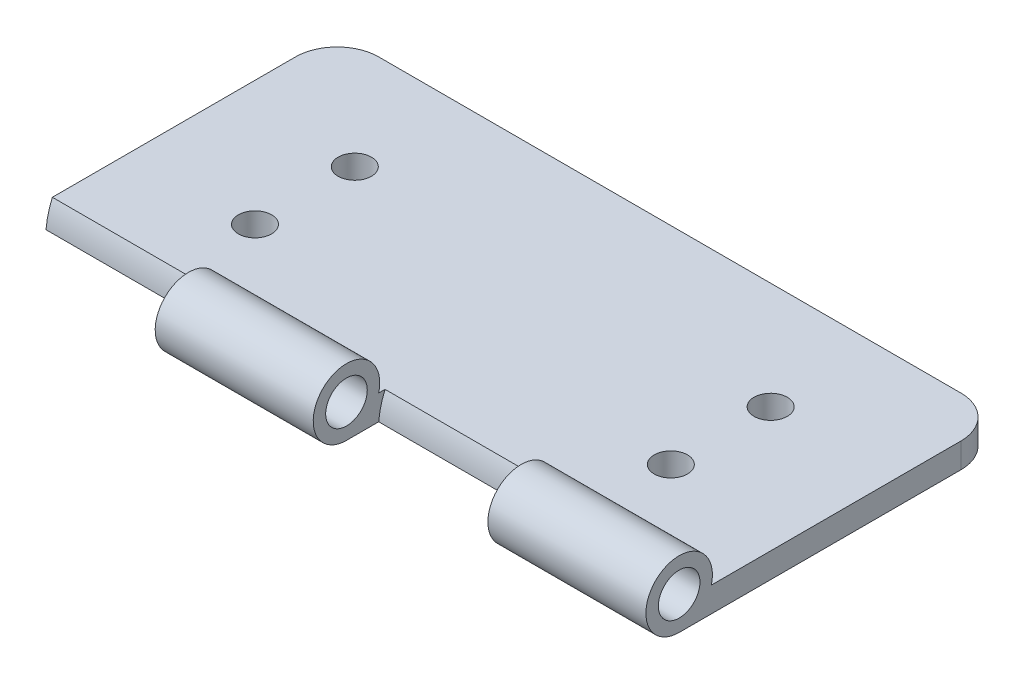
ISO-10303-21;
HEADER;
FILE_DESCRIPTION(('STEP AP214'),'2;1');
FILE_NAME('part.step','',(''),(''),'','','');
FILE_SCHEMA(('AUTOMOTIVE_DESIGN { 1 0 10303 214 1 1 1 1 }'));
ENDSEC;
DATA;
#1=APPLICATION_CONTEXT('core data for automotive mechanical design processes');
#2=APPLICATION_PROTOCOL_DEFINITION('international standard','automotive_design',2000,#1);
#3=PRODUCT_CONTEXT('',#1,'mechanical');
#4=PRODUCT('Part','Part','',(#3));
#5=PRODUCT_RELATED_PRODUCT_CATEGORY('part','',(#4));
#6=PRODUCT_DEFINITION_FORMATION('','',#4);
#7=PRODUCT_DEFINITION_CONTEXT('part definition',#1,'design');
#8=PRODUCT_DEFINITION('design','',#6,#7);
#9=PRODUCT_DEFINITION_SHAPE('','',#8);
#10=(LENGTH_UNIT() NAMED_UNIT(*) SI_UNIT(.MILLI.,.METRE.));
#11=(NAMED_UNIT(*) PLANE_ANGLE_UNIT() SI_UNIT($,.RADIAN.));
#12=(NAMED_UNIT(*) SI_UNIT($,.STERADIAN.) SOLID_ANGLE_UNIT());
#13=UNCERTAINTY_MEASURE_WITH_UNIT(LENGTH_MEASURE(1.E-05),#10,'distance_accuracy_value','');
#14=(GEOMETRIC_REPRESENTATION_CONTEXT(3) GLOBAL_UNCERTAINTY_ASSIGNED_CONTEXT((#13)) GLOBAL_UNIT_ASSIGNED_CONTEXT((#10,
#11,#12)) REPRESENTATION_CONTEXT('',''));
#15=CARTESIAN_POINT('',(0.,0.,0.));
#16=DIRECTION('',(0.,0.,1.));
#17=DIRECTION('',(1.,0.,0.));
#18=AXIS2_PLACEMENT_3D('',#15,#16,#17);
#19=CARTESIAN_POINT('',(40.,3.,-12.5));
#20=DIRECTION('',(-1.,0.,0.));
#21=DIRECTION('',(0.,0.,1.));
#22=AXIS2_PLACEMENT_3D('',#19,#20,#21);
#23=PLANE('',#22);
#24=DIRECTION('',(0.,0.,-1.));
#25=VECTOR('',#24,1.);
#26=CARTESIAN_POINT('',(40.,0.,-12.5));
#27=LINE('',#26,#25);
#28=CARTESIAN_POINT('',(40.,0.,21.3729833462074));
#29=VERTEX_POINT('',#28);
#30=CARTESIAN_POINT('',(40.,0.,-12.5));
#31=VERTEX_POINT('',#30);
#32=EDGE_CURVE('E181',#29,#31,#27,.T.);
#33=ORIENTED_EDGE('',*,*,#32,.T.);
#34=DIRECTION('',(0.,-1.,0.));
#35=VECTOR('',#34,1.);
#36=CARTESIAN_POINT('',(40.,3.,-12.5));
#37=LINE('',#36,#35);
#38=CARTESIAN_POINT('',(40.,3.,-12.5));
#39=VERTEX_POINT('',#38);
#40=EDGE_CURVE('E218',#39,#31,#37,.T.);
#41=ORIENTED_EDGE('',*,*,#40,.F.);
#42=DIRECTION('',(0.,0.,-1.));
#43=VECTOR('',#42,1.);
#44=CARTESIAN_POINT('',(40.,3.,-12.5));
#45=LINE('',#44,#43);
#46=CARTESIAN_POINT('',(40.,3.,17.5));
#47=VERTEX_POINT('',#46);
#48=EDGE_CURVE('E183',#47,#39,#45,.T.);
#49=ORIENTED_EDGE('',*,*,#48,.F.);
#50=CARTESIAN_POINT('',(40.,4.,21.3729833462074));
#51=DIRECTION('',(1.,0.,0.));
#52=DIRECTION('',(0.,0.,-1.));
#53=AXIS2_PLACEMENT_3D('',#50,#51,#52);
#54=CIRCLE('',#53,4.);
#55=EDGE_CURVE('E168',#47,#29,#54,.T.);
#56=ORIENTED_EDGE('',*,*,#55,.T.);
#57=EDGE_LOOP('',(#33,#41,#49,#56));
#58=FACE_BOUND('',#57,.T.);
#59=CARTESIAN_POINT('',(40.,4.,21.3729833462074));
#60=DIRECTION('',(1.,0.,0.));
#61=DIRECTION('',(0.,0.,-1.));
#62=AXIS2_PLACEMENT_3D('',#59,#60,#61);
#63=CIRCLE('',#62,2.5);
#64=CARTESIAN_POINT('',(40.,4.,18.8729833462074));
#65=VERTEX_POINT('',#64);
#66=EDGE_CURVE('E146',#65,#65,#63,.T.);
#67=ORIENTED_EDGE('',*,*,#66,.F.);
#68=EDGE_LOOP('',(#67));
#69=FACE_BOUND('',#68,.T.);
#70=ADVANCED_FACE('F38',(#58,#69),#23,.F.);
#71=CARTESIAN_POINT('',(35.,3.,-12.5));
#72=DIRECTION('',(0.,-1.,0.));
#73=DIRECTION('',(0.,0.,-1.));
#74=AXIS2_PLACEMENT_3D('',#71,#72,#73);
#75=CYLINDRICAL_SURFACE('',#74,5.);
#76=CARTESIAN_POINT('',(35.,0.,-12.5));
#77=DIRECTION('',(0.,1.,0.));
#78=DIRECTION('',(0.,0.,1.));
#79=AXIS2_PLACEMENT_3D('',#76,#77,#78);
#80=CIRCLE('',#79,5.);
#81=CARTESIAN_POINT('',(35.,0.,-17.5));
#82=VERTEX_POINT('',#81);
#83=EDGE_CURVE('E199',#31,#82,#80,.T.);
#84=ORIENTED_EDGE('',*,*,#83,.T.);
#85=DIRECTION('',(0.,-1.,0.));
#86=VECTOR('',#85,1.);
#87=CARTESIAN_POINT('',(35.,3.,-17.5));
#88=LINE('',#87,#86);
#89=CARTESIAN_POINT('',(35.,3.,-17.5));
#90=VERTEX_POINT('',#89);
#91=EDGE_CURVE('E215',#90,#82,#88,.T.);
#92=ORIENTED_EDGE('',*,*,#91,.F.);
#93=CARTESIAN_POINT('',(35.,3.,-12.5));
#94=DIRECTION('',(0.,1.,0.));
#95=DIRECTION('',(0.,0.,1.));
#96=AXIS2_PLACEMENT_3D('',#93,#94,#95);
#97=CIRCLE('',#96,5.);
#98=EDGE_CURVE('E186',#39,#90,#97,.T.);
#99=ORIENTED_EDGE('',*,*,#98,.F.);
#100=ORIENTED_EDGE('',*,*,#40,.T.);
#101=EDGE_LOOP('',(#84,#92,#99,#100));
#102=FACE_BOUND('',#101,.T.);
#103=ADVANCED_FACE('F263',(#102),#75,.T.);
#104=CARTESIAN_POINT('',(-35.,3.,-17.5));
#105=DIRECTION('',(0.,0.,1.));
#106=DIRECTION('',(1.,0.,0.));
#107=AXIS2_PLACEMENT_3D('',#104,#105,#106);
#108=PLANE('',#107);
#109=DIRECTION('',(-1.,0.,0.));
#110=VECTOR('',#109,1.);
#111=CARTESIAN_POINT('',(-35.,0.,-17.5));
#112=LINE('',#111,#110);
#113=CARTESIAN_POINT('',(-35.,0.,-17.5));
#114=VERTEX_POINT('',#113);
#115=EDGE_CURVE('E201',#82,#114,#112,.T.);
#116=ORIENTED_EDGE('',*,*,#115,.T.);
#117=DIRECTION('',(0.,-1.,0.));
#118=VECTOR('',#117,1.);
#119=CARTESIAN_POINT('',(-35.,3.,-17.5));
#120=LINE('',#119,#118);
#121=CARTESIAN_POINT('',(-35.,3.,-17.5));
#122=VERTEX_POINT('',#121);
#123=EDGE_CURVE('E212',#122,#114,#120,.T.);
#124=ORIENTED_EDGE('',*,*,#123,.F.);
#125=DIRECTION('',(-1.,0.,0.));
#126=VECTOR('',#125,1.);
#127=CARTESIAN_POINT('',(-35.,3.,-17.5));
#128=LINE('',#127,#126);
#129=EDGE_CURVE('E189',#90,#122,#128,.T.);
#130=ORIENTED_EDGE('',*,*,#129,.F.);
#131=ORIENTED_EDGE('',*,*,#91,.T.);
#132=EDGE_LOOP('',(#116,#124,#130,#131));
#133=FACE_BOUND('',#132,.T.);
#134=ADVANCED_FACE('F259',(#133),#108,.F.);
#135=CARTESIAN_POINT('',(-35.,3.,-12.5));
#136=DIRECTION('',(0.,-1.,0.));
#137=DIRECTION('',(0.,0.,-1.));
#138=AXIS2_PLACEMENT_3D('',#135,#136,#137);
#139=CYLINDRICAL_SURFACE('',#138,5.);
#140=CARTESIAN_POINT('',(-35.,0.,-12.5));
#141=DIRECTION('',(0.,1.,0.));
#142=DIRECTION('',(0.,0.,-1.));
#143=AXIS2_PLACEMENT_3D('',#140,#141,#142);
#144=CIRCLE('',#143,5.);
#145=CARTESIAN_POINT('',(-40.,0.,-12.5));
#146=VERTEX_POINT('',#145);
#147=EDGE_CURVE('E203',#114,#146,#144,.T.);
#148=ORIENTED_EDGE('',*,*,#147,.T.);
#149=DIRECTION('',(0.,-1.,0.));
#150=VECTOR('',#149,1.);
#151=CARTESIAN_POINT('',(-40.,3.,-12.5));
#152=LINE('',#151,#150);
#153=CARTESIAN_POINT('',(-40.,3.,-12.5));
#154=VERTEX_POINT('',#153);
#155=EDGE_CURVE('E196',#154,#146,#152,.T.);
#156=ORIENTED_EDGE('',*,*,#155,.F.);
#157=CARTESIAN_POINT('',(-35.,3.,-12.5));
#158=DIRECTION('',(0.,1.,0.));
#159=DIRECTION('',(0.,0.,-1.));
#160=AXIS2_PLACEMENT_3D('',#157,#158,#159);
#161=CIRCLE('',#160,5.);
#162=EDGE_CURVE('E191',#122,#154,#161,.T.);
#163=ORIENTED_EDGE('',*,*,#162,.F.);
#164=ORIENTED_EDGE('',*,*,#123,.T.);
#165=EDGE_LOOP('',(#148,#156,#163,#164));
#166=FACE_BOUND('',#165,.T.);
#167=ADVANCED_FACE('F255',(#166),#139,.T.);
#168=CARTESIAN_POINT('',(-40.,3.,-12.5));
#169=DIRECTION('',(1.,0.,0.));
#170=DIRECTION('',(0.,0.,-1.));
#171=AXIS2_PLACEMENT_3D('',#168,#169,#170);
#172=PLANE('',#171);
#173=DIRECTION('',(0.,0.,1.));
#174=VECTOR('',#173,1.);
#175=CARTESIAN_POINT('',(-40.,0.,-12.5));
#176=LINE('',#175,#174);
#177=CARTESIAN_POINT('',(-40.,0.,17.5));
#178=VERTEX_POINT('',#177);
#179=EDGE_CURVE('E205',#146,#178,#176,.T.);
#180=ORIENTED_EDGE('',*,*,#179,.T.);
#181=CARTESIAN_POINT('',(-40.,-0.938013702814571,7.54409068475752));
#182=DIRECTION('',(1.,0.,0.));
#183=DIRECTION('',(0.,0.,-1.));
#184=AXIS2_PLACEMENT_3D('',#181,#182,#183);
#185=CIRCLE('',#184,10.);
#186=CARTESIAN_POINT('',(-40.,3.,16.7360463023856));
#187=VERTEX_POINT('',#186);
#188=EDGE_CURVE('E230',#178,#187,#185,.F.);
#189=ORIENTED_EDGE('',*,*,#188,.T.);
#190=DIRECTION('',(0.,0.,1.));
#191=VECTOR('',#190,1.);
#192=CARTESIAN_POINT('',(-40.,3.,-12.5));
#193=LINE('',#192,#191);
#194=EDGE_CURVE('E193',#154,#187,#193,.T.);
#195=ORIENTED_EDGE('',*,*,#194,.F.);
#196=ORIENTED_EDGE('',*,*,#155,.T.);
#197=EDGE_LOOP('',(#180,#189,#195,#196));
#198=FACE_BOUND('',#197,.T.);
#199=ADVANCED_FACE('F251',(#198),#172,.F.);
#200=CARTESIAN_POINT('',(-35.,3.,-12.5));
#201=DIRECTION('',(0.,-1.,0.));
#202=DIRECTION('',(0.,0.,-1.));
#203=AXIS2_PLACEMENT_3D('',#200,#201,#202);
#204=PLANE('',#203);
#205=CARTESIAN_POINT('',(-25.,3.,-4.62701665379257));
#206=DIRECTION('',(0.,-1.,0.));
#207=DIRECTION('',(0.,0.,-1.));
#208=AXIS2_PLACEMENT_3D('',#205,#206,#207);
#209=CIRCLE('',#208,2.);
#210=CARTESIAN_POINT('',(-25.,3.,-6.62701665379257));
#211=VERTEX_POINT('',#210);
#212=EDGE_CURVE('E160',#211,#211,#209,.T.);
#213=ORIENTED_EDGE('',*,*,#212,.T.);
#214=EDGE_LOOP('',(#213));
#215=FACE_BOUND('',#214,.T.);
#216=CARTESIAN_POINT('',(25.,3.,7.37298334620743));
#217=DIRECTION('',(0.,-1.,0.));
#218=DIRECTION('',(0.,0.,-1.));
#219=AXIS2_PLACEMENT_3D('',#216,#217,#218);
#220=CIRCLE('',#219,2.);
#221=CARTESIAN_POINT('',(25.,3.,5.37298334620743));
#222=VERTEX_POINT('',#221);
#223=EDGE_CURVE('E404',#222,#222,#220,.T.);
#224=ORIENTED_EDGE('',*,*,#223,.T.);
#225=EDGE_LOOP('',(#224));
#226=FACE_BOUND('',#225,.T.);
#227=CARTESIAN_POINT('',(25.,3.,-4.62701665379257));
#228=DIRECTION('',(0.,-1.,0.));
#229=DIRECTION('',(0.,0.,-1.));
#230=AXIS2_PLACEMENT_3D('',#227,#228,#229);
#231=CIRCLE('',#230,2.);
#232=CARTESIAN_POINT('',(25.,3.,-6.62701665379257));
#233=VERTEX_POINT('',#232);
#234=EDGE_CURVE('E406',#233,#233,#231,.T.);
#235=ORIENTED_EDGE('',*,*,#234,.T.);
#236=EDGE_LOOP('',(#235));
#237=FACE_BOUND('',#236,.T.);
#238=CARTESIAN_POINT('',(-25.,3.,7.37298334620743));
#239=DIRECTION('',(0.,-1.,0.));
#240=DIRECTION('',(0.,0.,-1.));
#241=AXIS2_PLACEMENT_3D('',#238,#239,#240);
#242=CIRCLE('',#241,2.);
#243=CARTESIAN_POINT('',(-25.,3.,5.37298334620743));
#244=VERTEX_POINT('',#243);
#245=EDGE_CURVE('E411',#244,#244,#242,.T.);
#246=ORIENTED_EDGE('',*,*,#245,.T.);
#247=EDGE_LOOP('',(#246));
#248=FACE_BOUND('',#247,.T.);
#249=DIRECTION('',(0.,0.,-1.));
#250=VECTOR('',#249,1.);
#251=CARTESIAN_POINT('',(0.,3.,0.));
#252=LINE('',#251,#250);
#253=CARTESIAN_POINT('',(0.,3.,17.5));
#254=VERTEX_POINT('',#253);
#255=CARTESIAN_POINT('',(0.,3.,16.7360463023856));
#256=VERTEX_POINT('',#255);
#257=EDGE_CURVE('E60',#254,#256,#252,.T.);
#258=ORIENTED_EDGE('',*,*,#257,.T.);
#259=DIRECTION('',(-1.,0.,0.));
#260=VECTOR('',#259,1.);
#261=CARTESIAN_POINT('',(10.5,3.,16.7360463023856));
#262=LINE('',#261,#260);
#263=CARTESIAN_POINT('',(21.,3.,16.7360463023856));
#264=VERTEX_POINT('',#263);
#265=EDGE_CURVE('E228',#256,#264,#262,.F.);
#266=ORIENTED_EDGE('',*,*,#265,.T.);
#267=DIRECTION('',(0.,0.,1.));
#268=VECTOR('',#267,1.);
#269=CARTESIAN_POINT('',(21.,3.,-12.5));
#270=LINE('',#269,#268);
#271=CARTESIAN_POINT('',(21.,3.,17.5));
#272=VERTEX_POINT('',#271);
#273=EDGE_CURVE('E53',#264,#272,#270,.T.);
#274=ORIENTED_EDGE('',*,*,#273,.T.);
#275=DIRECTION('',(1.,0.,0.));
#276=VECTOR('',#275,1.);
#277=CARTESIAN_POINT('',(21.,3.,17.5));
#278=LINE('',#277,#276);
#279=EDGE_CURVE('E173',#272,#47,#278,.T.);
#280=ORIENTED_EDGE('',*,*,#279,.T.);
#281=ORIENTED_EDGE('',*,*,#48,.T.);
#282=ORIENTED_EDGE('',*,*,#98,.T.);
#283=ORIENTED_EDGE('',*,*,#129,.T.);
#284=ORIENTED_EDGE('',*,*,#162,.T.);
#285=ORIENTED_EDGE('',*,*,#194,.T.);
#286=DIRECTION('',(-1.,0.,0.));
#287=VECTOR('',#286,1.);
#288=CARTESIAN_POINT('',(-29.5,3.,16.7360463023856));
#289=LINE('',#288,#287);
#290=CARTESIAN_POINT('',(-19.,3.,16.7360463023856));
#291=VERTEX_POINT('',#290);
#292=EDGE_CURVE('E225',#187,#291,#289,.F.);
#293=ORIENTED_EDGE('',*,*,#292,.T.);
#294=DIRECTION('',(0.,0.,1.));
#295=VECTOR('',#294,1.);
#296=CARTESIAN_POINT('',(-19.,3.,-12.5));
#297=LINE('',#296,#295);
#298=CARTESIAN_POINT('',(-19.,3.,17.5));
#299=VERTEX_POINT('',#298);
#300=EDGE_CURVE('E221',#291,#299,#297,.T.);
#301=ORIENTED_EDGE('',*,*,#300,.T.);
#302=DIRECTION('',(1.,0.,0.));
#303=VECTOR('',#302,1.);
#304=CARTESIAN_POINT('',(-19.,3.,17.5));
#305=LINE('',#304,#303);
#306=EDGE_CURVE('E135',#299,#254,#305,.T.);
#307=ORIENTED_EDGE('',*,*,#306,.T.);
#308=EDGE_LOOP('',(#258,#266,#274,#280,#281,#282,#283,#284,#285,#293,#301,#307));
#309=FACE_BOUND('',#308,.T.);
#310=ADVANCED_FACE('F243',(#215,#226,#237,#248,#309),#204,.F.);
#311=CARTESIAN_POINT('',(-35.,0.,-12.5));
#312=DIRECTION('',(0.,-1.,0.));
#313=DIRECTION('',(0.,0.,-1.));
#314=AXIS2_PLACEMENT_3D('',#311,#312,#313);
#315=PLANE('',#314);
#316=CARTESIAN_POINT('',(-25.,0.,-4.62701665379257));
#317=DIRECTION('',(0.,-1.,0.));
#318=DIRECTION('',(0.,0.,-1.));
#319=AXIS2_PLACEMENT_3D('',#316,#317,#318);
#320=CIRCLE('',#319,2.);
#321=CARTESIAN_POINT('',(-25.,0.,-6.62701665379257));
#322=VERTEX_POINT('',#321);
#323=EDGE_CURVE('E401',#322,#322,#320,.T.);
#324=ORIENTED_EDGE('',*,*,#323,.F.);
#325=EDGE_LOOP('',(#324));
#326=FACE_BOUND('',#325,.T.);
#327=CARTESIAN_POINT('',(25.,0.,7.37298334620743));
#328=DIRECTION('',(0.,-1.,0.));
#329=DIRECTION('',(0.,0.,-1.));
#330=AXIS2_PLACEMENT_3D('',#327,#328,#329);
#331=CIRCLE('',#330,2.);
#332=CARTESIAN_POINT('',(25.,0.,5.37298334620743));
#333=VERTEX_POINT('',#332);
#334=EDGE_CURVE('E417',#333,#333,#331,.T.);
#335=ORIENTED_EDGE('',*,*,#334,.F.);
#336=EDGE_LOOP('',(#335));
#337=FACE_BOUND('',#336,.T.);
#338=CARTESIAN_POINT('',(25.,0.,-4.62701665379257));
#339=DIRECTION('',(0.,-1.,0.));
#340=DIRECTION('',(0.,0.,-1.));
#341=AXIS2_PLACEMENT_3D('',#338,#339,#340);
#342=CIRCLE('',#341,2.);
#343=CARTESIAN_POINT('',(25.,0.,-6.62701665379257));
#344=VERTEX_POINT('',#343);
#345=EDGE_CURVE('E420',#344,#344,#342,.T.);
#346=ORIENTED_EDGE('',*,*,#345,.F.);
#347=EDGE_LOOP('',(#346));
#348=FACE_BOUND('',#347,.T.);
#349=CARTESIAN_POINT('',(-25.,0.,7.37298334620743));
#350=DIRECTION('',(0.,-1.,0.));
#351=DIRECTION('',(0.,0.,-1.));
#352=AXIS2_PLACEMENT_3D('',#349,#350,#351);
#353=CIRCLE('',#352,2.);
#354=CARTESIAN_POINT('',(-25.,0.,5.37298334620743));
#355=VERTEX_POINT('',#354);
#356=EDGE_CURVE('E414',#355,#355,#353,.T.);
#357=ORIENTED_EDGE('',*,*,#356,.F.);
#358=EDGE_LOOP('',(#357));
#359=FACE_BOUND('',#358,.T.);
#360=ORIENTED_EDGE('',*,*,#32,.F.);
#361=DIRECTION('',(1.,0.,0.));
#362=VECTOR('',#361,1.);
#363=CARTESIAN_POINT('',(21.,0.,21.3729833462074));
#364=LINE('',#363,#362);
#365=CARTESIAN_POINT('',(21.,0.,21.3729833462074));
#366=VERTEX_POINT('',#365);
#367=EDGE_CURVE('E178',#366,#29,#364,.T.);
#368=ORIENTED_EDGE('',*,*,#367,.F.);
#369=DIRECTION('',(0.,0.,1.));
#370=VECTOR('',#369,1.);
#371=CARTESIAN_POINT('',(21.,0.,0.));
#372=LINE('',#371,#370);
#373=CARTESIAN_POINT('',(21.,0.,17.5));
#374=VERTEX_POINT('',#373);
#375=EDGE_CURVE('E171',#374,#366,#372,.T.);
#376=ORIENTED_EDGE('',*,*,#375,.F.);
#377=DIRECTION('',(1.,0.,0.));
#378=VECTOR('',#377,1.);
#379=CARTESIAN_POINT('',(-40.,0.,17.5));
#380=LINE('',#379,#378);
#381=CARTESIAN_POINT('',(0.,0.,17.5));
#382=VERTEX_POINT('',#381);
#383=EDGE_CURVE('E208',#382,#374,#380,.T.);
#384=ORIENTED_EDGE('',*,*,#383,.F.);
#385=DIRECTION('',(0.,0.,1.));
#386=VECTOR('',#385,1.);
#387=CARTESIAN_POINT('',(0.,0.,0.));
#388=LINE('',#387,#386);
#389=CARTESIAN_POINT('',(0.,0.,21.3729833462074));
#390=VERTEX_POINT('',#389);
#391=EDGE_CURVE('E142',#382,#390,#388,.T.);
#392=ORIENTED_EDGE('',*,*,#391,.T.);
#393=DIRECTION('',(1.,0.,0.));
#394=VECTOR('',#393,1.);
#395=CARTESIAN_POINT('',(-19.,0.,21.3729833462074));
#396=LINE('',#395,#394);
#397=CARTESIAN_POINT('',(-19.,0.,21.3729833462074));
#398=VERTEX_POINT('',#397);
#399=EDGE_CURVE('E138',#398,#390,#396,.T.);
#400=ORIENTED_EDGE('',*,*,#399,.F.);
#401=DIRECTION('',(0.,0.,1.));
#402=VECTOR('',#401,1.);
#403=CARTESIAN_POINT('',(-19.,0.,0.));
#404=LINE('',#403,#402);
#405=CARTESIAN_POINT('',(-19.,0.,17.5));
#406=VERTEX_POINT('',#405);
#407=EDGE_CURVE('E126',#406,#398,#404,.T.);
#408=ORIENTED_EDGE('',*,*,#407,.F.);
#409=EDGE_CURVE('E187',#178,#406,#380,.T.);
#410=ORIENTED_EDGE('',*,*,#409,.F.);
#411=ORIENTED_EDGE('',*,*,#179,.F.);
#412=ORIENTED_EDGE('',*,*,#147,.F.);
#413=ORIENTED_EDGE('',*,*,#115,.F.);
#414=ORIENTED_EDGE('',*,*,#83,.F.);
#415=EDGE_LOOP('',(#360,#368,#376,#384,#392,#400,#408,#410,#411,#412,#413,#414));
#416=FACE_BOUND('',#415,.T.);
#417=ADVANCED_FACE('F139',(#326,#337,#348,#359,#416),#315,.T.);
#418=CARTESIAN_POINT('',(21.,4.,21.3729833462074));
#419=DIRECTION('',(1.,0.,0.));
#420=DIRECTION('',(0.,0.,-1.));
#421=AXIS2_PLACEMENT_3D('',#418,#419,#420);
#422=CYLINDRICAL_SURFACE('',#421,2.5);
#423=CARTESIAN_POINT('',(21.,4.,21.3729833462074));
#424=DIRECTION('',(1.,0.,0.));
#425=DIRECTION('',(0.,0.,-1.));
#426=AXIS2_PLACEMENT_3D('',#423,#424,#425);
#427=CIRCLE('',#426,2.5);
#428=CARTESIAN_POINT('',(21.,4.,18.8729833462074));
#429=VERTEX_POINT('',#428);
#430=EDGE_CURVE('E164',#429,#429,#427,.T.);
#431=ORIENTED_EDGE('',*,*,#430,.F.);
#432=EDGE_LOOP('',(#431));
#433=FACE_BOUND('',#432,.T.);
#434=ORIENTED_EDGE('',*,*,#66,.T.);
#435=EDGE_LOOP('',(#434));
#436=FACE_BOUND('',#435,.T.);
#437=ADVANCED_FACE('F272',(#433,#436),#422,.F.);
#438=CARTESIAN_POINT('',(21.,4.,21.3729833462074));
#439=DIRECTION('',(1.,0.,0.));
#440=DIRECTION('',(0.,0.,-1.));
#441=AXIS2_PLACEMENT_3D('',#438,#439,#440);
#442=CYLINDRICAL_SURFACE('',#441,4.);
#443=ORIENTED_EDGE('',*,*,#55,.F.);
#444=ORIENTED_EDGE('',*,*,#279,.F.);
#445=CARTESIAN_POINT('',(21.,4.,21.3729833462074));
#446=DIRECTION('',(1.,0.,0.));
#447=DIRECTION('',(0.,0.,-1.));
#448=AXIS2_PLACEMENT_3D('',#445,#446,#447);
#449=CIRCLE('',#448,4.);
#450=EDGE_CURVE('E167',#272,#366,#449,.T.);
#451=ORIENTED_EDGE('',*,*,#450,.T.);
#452=ORIENTED_EDGE('',*,*,#367,.T.);
#453=EDGE_LOOP('',(#443,#444,#451,#452));
#454=FACE_BOUND('',#453,.T.);
#455=ADVANCED_FACE('F270',(#454),#442,.T.);
#456=CARTESIAN_POINT('',(21.,0.,0.));
#457=DIRECTION('',(1.,0.,0.));
#458=DIRECTION('',(0.,0.,-1.));
#459=AXIS2_PLACEMENT_3D('',#456,#457,#458);
#460=PLANE('',#459);
#461=ORIENTED_EDGE('',*,*,#430,.T.);
#462=EDGE_LOOP('',(#461));
#463=FACE_BOUND('',#462,.T.);
#464=ORIENTED_EDGE('',*,*,#450,.F.);
#465=ORIENTED_EDGE('',*,*,#273,.F.);
#466=CARTESIAN_POINT('',(21.,-0.938013702814571,7.54409068475752));
#467=DIRECTION('',(1.,0.,0.));
#468=DIRECTION('',(0.,0.,-1.));
#469=AXIS2_PLACEMENT_3D('',#466,#467,#468);
#470=CIRCLE('',#469,10.);
#471=EDGE_CURVE('E46',#264,#374,#470,.T.);
#472=ORIENTED_EDGE('',*,*,#471,.T.);
#473=ORIENTED_EDGE('',*,*,#375,.T.);
#474=EDGE_LOOP('',(#464,#465,#472,#473));
#475=FACE_BOUND('',#474,.T.);
#476=ADVANCED_FACE('F235',(#463,#475),#460,.F.);
#477=CARTESIAN_POINT('',(-19.,4.,21.3729833462074));
#478=DIRECTION('',(1.,0.,0.));
#479=DIRECTION('',(0.,0.,-1.));
#480=AXIS2_PLACEMENT_3D('',#477,#478,#479);
#481=CYLINDRICAL_SURFACE('',#480,2.5);
#482=CARTESIAN_POINT('',(-19.,4.,21.3729833462074));
#483=DIRECTION('',(1.,0.,0.));
#484=DIRECTION('',(0.,0.,-1.));
#485=AXIS2_PLACEMENT_3D('',#482,#483,#484);
#486=CIRCLE('',#485,2.5);
#487=CARTESIAN_POINT('',(-19.,4.,18.8729833462074));
#488=VERTEX_POINT('',#487);
#489=EDGE_CURVE('E150',#488,#488,#486,.T.);
#490=ORIENTED_EDGE('',*,*,#489,.F.);
#491=EDGE_LOOP('',(#490));
#492=FACE_BOUND('',#491,.T.);
#493=CARTESIAN_POINT('',(0.,4.,21.3729833462074));
#494=DIRECTION('',(1.,0.,0.));
#495=DIRECTION('',(0.,0.,-1.));
#496=AXIS2_PLACEMENT_3D('',#493,#494,#495);
#497=CIRCLE('',#496,2.5);
#498=CARTESIAN_POINT('',(0.,4.,18.8729833462074));
#499=VERTEX_POINT('',#498);
#500=EDGE_CURVE('E156',#499,#499,#497,.T.);
#501=ORIENTED_EDGE('',*,*,#500,.T.);
#502=EDGE_LOOP('',(#501));
#503=FACE_BOUND('',#502,.T.);
#504=ADVANCED_FACE('F278',(#492,#503),#481,.F.);
#505=CARTESIAN_POINT('',(-19.,4.,21.3729833462074));
#506=DIRECTION('',(1.,0.,0.));
#507=DIRECTION('',(0.,0.,-1.));
#508=AXIS2_PLACEMENT_3D('',#505,#506,#507);
#509=CYLINDRICAL_SURFACE('',#508,4.);
#510=CARTESIAN_POINT('',(0.,4.,21.3729833462074));
#511=DIRECTION('',(1.,0.,0.));
#512=DIRECTION('',(0.,0.,-1.));
#513=AXIS2_PLACEMENT_3D('',#510,#511,#512);
#514=CIRCLE('',#513,4.);
#515=EDGE_CURVE('E159',#254,#390,#514,.T.);
#516=ORIENTED_EDGE('',*,*,#515,.F.);
#517=ORIENTED_EDGE('',*,*,#306,.F.);
#518=CARTESIAN_POINT('',(-19.,4.,21.3729833462074));
#519=DIRECTION('',(1.,0.,0.));
#520=DIRECTION('',(0.,0.,-1.));
#521=AXIS2_PLACEMENT_3D('',#518,#519,#520);
#522=CIRCLE('',#521,4.);
#523=EDGE_CURVE('E130',#299,#398,#522,.T.);
#524=ORIENTED_EDGE('',*,*,#523,.T.);
#525=ORIENTED_EDGE('',*,*,#399,.T.);
#526=EDGE_LOOP('',(#516,#517,#524,#525));
#527=FACE_BOUND('',#526,.T.);
#528=ADVANCED_FACE('F149',(#527),#509,.T.);
#529=CARTESIAN_POINT('',(-19.,0.,0.));
#530=DIRECTION('',(1.,0.,0.));
#531=DIRECTION('',(0.,0.,-1.));
#532=AXIS2_PLACEMENT_3D('',#529,#530,#531);
#533=PLANE('',#532);
#534=ORIENTED_EDGE('',*,*,#489,.T.);
#535=EDGE_LOOP('',(#534));
#536=FACE_BOUND('',#535,.T.);
#537=ORIENTED_EDGE('',*,*,#523,.F.);
#538=ORIENTED_EDGE('',*,*,#300,.F.);
#539=CARTESIAN_POINT('',(-19.,-0.938013702814571,7.54409068475752));
#540=DIRECTION('',(1.,0.,0.));
#541=DIRECTION('',(0.,0.,-1.));
#542=AXIS2_PLACEMENT_3D('',#539,#540,#541);
#543=CIRCLE('',#542,10.);
#544=EDGE_CURVE('E11',#291,#406,#543,.T.);
#545=ORIENTED_EDGE('',*,*,#544,.T.);
#546=ORIENTED_EDGE('',*,*,#407,.T.);
#547=EDGE_LOOP('',(#537,#538,#545,#546));
#548=FACE_BOUND('',#547,.T.);
#549=ADVANCED_FACE('F128',(#536,#548),#533,.F.);
#550=CARTESIAN_POINT('',(0.,0.,0.));
#551=DIRECTION('',(1.,0.,0.));
#552=DIRECTION('',(0.,0.,-1.));
#553=AXIS2_PLACEMENT_3D('',#550,#551,#552);
#554=PLANE('',#553);
#555=ORIENTED_EDGE('',*,*,#500,.F.);
#556=EDGE_LOOP('',(#555));
#557=FACE_BOUND('',#556,.T.);
#558=ORIENTED_EDGE('',*,*,#391,.F.);
#559=CARTESIAN_POINT('',(0.,-0.938013702814571,7.54409068475752));
#560=DIRECTION('',(1.,0.,0.));
#561=DIRECTION('',(0.,0.,-1.));
#562=AXIS2_PLACEMENT_3D('',#559,#560,#561);
#563=CIRCLE('',#562,10.);
#564=EDGE_CURVE('E232',#382,#256,#563,.F.);
#565=ORIENTED_EDGE('',*,*,#564,.T.);
#566=ORIENTED_EDGE('',*,*,#257,.F.);
#567=ORIENTED_EDGE('',*,*,#515,.T.);
#568=EDGE_LOOP('',(#558,#565,#566,#567));
#569=FACE_BOUND('',#568,.T.);
#570=ADVANCED_FACE('F242',(#557,#569),#554,.T.);
#571=CARTESIAN_POINT('',(-40.,-0.938013702814571,7.54409068475752));
#572=DIRECTION('',(-1.,0.,0.));
#573=DIRECTION('',(0.,0.,1.));
#574=AXIS2_PLACEMENT_3D('',#571,#572,#573);
#575=CYLINDRICAL_SURFACE('',#574,10.);
#576=ORIENTED_EDGE('',*,*,#471,.F.);
#577=ORIENTED_EDGE('',*,*,#265,.F.);
#578=ORIENTED_EDGE('',*,*,#564,.F.);
#579=ORIENTED_EDGE('',*,*,#383,.T.);
#580=EDGE_LOOP('',(#576,#577,#578,#579));
#581=FACE_BOUND('',#580,.T.);
#582=ADVANCED_FACE('F240',(#581),#575,.T.);
#583=CARTESIAN_POINT('',(-40.,-0.938013702814571,7.54409068475752));
#584=DIRECTION('',(-1.,0.,0.));
#585=DIRECTION('',(0.,0.,1.));
#586=AXIS2_PLACEMENT_3D('',#583,#584,#585);
#587=CYLINDRICAL_SURFACE('',#586,10.);
#588=ORIENTED_EDGE('',*,*,#544,.F.);
#589=ORIENTED_EDGE('',*,*,#292,.F.);
#590=ORIENTED_EDGE('',*,*,#188,.F.);
#591=ORIENTED_EDGE('',*,*,#409,.T.);
#592=EDGE_LOOP('',(#588,#589,#590,#591));
#593=FACE_BOUND('',#592,.T.);
#594=ADVANCED_FACE('F40',(#593),#587,.T.);
#595=CARTESIAN_POINT('',(-25.,8.,7.37298334620743));
#596=DIRECTION('',(0.,-1.,0.));
#597=DIRECTION('',(0.,0.,-1.));
#598=AXIS2_PLACEMENT_3D('',#595,#596,#597);
#599=CYLINDRICAL_SURFACE('',#598,2.);
#600=ORIENTED_EDGE('',*,*,#356,.T.);
#601=EDGE_LOOP('',(#600));
#602=FACE_BOUND('',#601,.T.);
#603=ORIENTED_EDGE('',*,*,#245,.F.);
#604=EDGE_LOOP('',(#603));
#605=FACE_BOUND('',#604,.T.);
#606=ADVANCED_FACE('F295',(#602,#605),#599,.F.);
#607=CARTESIAN_POINT('',(25.,8.,-4.62701665379257));
#608=DIRECTION('',(0.,-1.,0.));
#609=DIRECTION('',(0.,0.,-1.));
#610=AXIS2_PLACEMENT_3D('',#607,#608,#609);
#611=CYLINDRICAL_SURFACE('',#610,2.);
#612=ORIENTED_EDGE('',*,*,#345,.T.);
#613=EDGE_LOOP('',(#612));
#614=FACE_BOUND('',#613,.T.);
#615=ORIENTED_EDGE('',*,*,#234,.F.);
#616=EDGE_LOOP('',(#615));
#617=FACE_BOUND('',#616,.T.);
#618=ADVANCED_FACE('F365',(#614,#617),#611,.F.);
#619=CARTESIAN_POINT('',(25.,8.,7.37298334620743));
#620=DIRECTION('',(0.,-1.,0.));
#621=DIRECTION('',(0.,0.,-1.));
#622=AXIS2_PLACEMENT_3D('',#619,#620,#621);
#623=CYLINDRICAL_SURFACE('',#622,2.);
#624=ORIENTED_EDGE('',*,*,#334,.T.);
#625=EDGE_LOOP('',(#624));
#626=FACE_BOUND('',#625,.T.);
#627=ORIENTED_EDGE('',*,*,#223,.F.);
#628=EDGE_LOOP('',(#627));
#629=FACE_BOUND('',#628,.T.);
#630=ADVANCED_FACE('F374',(#626,#629),#623,.F.);
#631=CARTESIAN_POINT('',(-25.,8.,-4.62701665379257));
#632=DIRECTION('',(0.,-1.,0.));
#633=DIRECTION('',(0.,0.,-1.));
#634=AXIS2_PLACEMENT_3D('',#631,#632,#633);
#635=CYLINDRICAL_SURFACE('',#634,2.);
#636=ORIENTED_EDGE('',*,*,#323,.T.);
#637=EDGE_LOOP('',(#636));
#638=FACE_BOUND('',#637,.T.);
#639=ORIENTED_EDGE('',*,*,#212,.F.);
#640=EDGE_LOOP('',(#639));
#641=FACE_BOUND('',#640,.T.);
#642=ADVANCED_FACE('F384',(#638,#641),#635,.F.);
#643=CLOSED_SHELL('',(#70,#103,#134,#167,#199,#310,#417,#437,#455,#476,#504,#528,#549,#570,#582,
#594,#606,#618,#630,#642));
#644=MANIFOLD_SOLID_BREP('B2',#643);
#645=ADVANCED_BREP_SHAPE_REPRESENTATION('',(#18,#644),#14);
#646=SHAPE_DEFINITION_REPRESENTATION(#9,#645);
ENDSEC;
END-ISO-10303-21;
